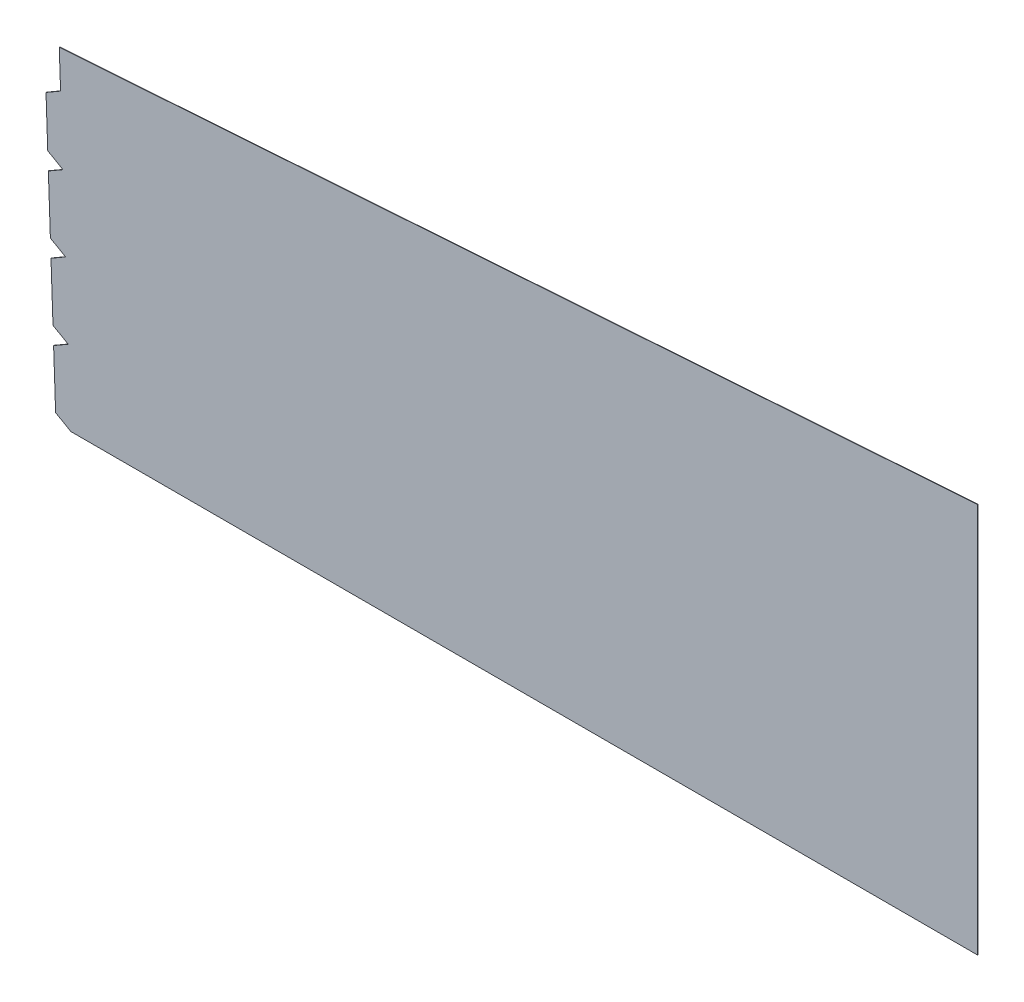
ISO-10303-21;
HEADER;
FILE_DESCRIPTION(('STEP AP214'),'2;1');
FILE_NAME('part.step','',(''),(''),'','','');
FILE_SCHEMA(('AUTOMOTIVE_DESIGN { 1 0 10303 214 1 1 1 1 }'));
ENDSEC;
DATA;
#1=APPLICATION_CONTEXT('core data for automotive mechanical design processes');
#2=APPLICATION_PROTOCOL_DEFINITION('international standard','automotive_design',2000,#1);
#3=PRODUCT_CONTEXT('',#1,'mechanical');
#4=PRODUCT('Part','Part','',(#3));
#5=PRODUCT_RELATED_PRODUCT_CATEGORY('part','',(#4));
#6=PRODUCT_DEFINITION_FORMATION('','',#4);
#7=PRODUCT_DEFINITION_CONTEXT('part definition',#1,'design');
#8=PRODUCT_DEFINITION('design','',#6,#7);
#9=PRODUCT_DEFINITION_SHAPE('','',#8);
#10=(LENGTH_UNIT() NAMED_UNIT(*) SI_UNIT(.MILLI.,.METRE.));
#11=(NAMED_UNIT(*) PLANE_ANGLE_UNIT() SI_UNIT($,.RADIAN.));
#12=(NAMED_UNIT(*) SI_UNIT($,.STERADIAN.) SOLID_ANGLE_UNIT());
#13=UNCERTAINTY_MEASURE_WITH_UNIT(LENGTH_MEASURE(1.E-05),#10,'distance_accuracy_value','');
#14=(GEOMETRIC_REPRESENTATION_CONTEXT(3) GLOBAL_UNCERTAINTY_ASSIGNED_CONTEXT((#13)) GLOBAL_UNIT_ASSIGNED_CONTEXT((#10,
#11,#12)) REPRESENTATION_CONTEXT('',''));
#15=CARTESIAN_POINT('',(0.,0.,0.));
#16=DIRECTION('',(0.,0.,1.));
#17=DIRECTION('',(1.,0.,0.));
#18=AXIS2_PLACEMENT_3D('',#15,#16,#17);
#19=CARTESIAN_POINT('',(0.,0.,0.761999999999999));
#20=DIRECTION('',(0.499999999999994,0.866025403784442,0.));
#21=DIRECTION('',(-0.866025403784442,0.499999999999994,0.));
#22=AXIS2_PLACEMENT_3D('',#19,#20,#21);
#23=PLANE('',#22);
#24=DIRECTION('',(0.866025403784442,-0.499999999999994,0.));
#25=VECTOR('',#24,1.);
#26=CARTESIAN_POINT('',(0.,0.,0.));
#27=LINE('',#26,#25);
#28=CARTESIAN_POINT('',(-25.9446484073002,14.9791497419847,0.));
#29=VERTEX_POINT('',#28);
#30=CARTESIAN_POINT('',(0.,0.,0.));
#31=VERTEX_POINT('',#30);
#32=EDGE_CURVE('E150',#29,#31,#27,.T.);
#33=ORIENTED_EDGE('',*,*,#32,.T.);
#34=DIRECTION('',(0.,0.,-1.));
#35=VECTOR('',#34,1.);
#36=CARTESIAN_POINT('',(0.,0.,0.761999999999999));
#37=LINE('',#36,#35);
#38=CARTESIAN_POINT('',(0.,0.,0.761999999999999));
#39=VERTEX_POINT('',#38);
#40=EDGE_CURVE('E11',#39,#31,#37,.T.);
#41=ORIENTED_EDGE('',*,*,#40,.F.);
#42=DIRECTION('',(0.866025403784442,-0.499999999999994,0.));
#43=VECTOR('',#42,1.);
#44=CARTESIAN_POINT('',(0.,0.,0.761999999999999));
#45=LINE('',#44,#43);
#46=CARTESIAN_POINT('',(-25.9446484073002,14.9791497419847,0.761999999999999));
#47=VERTEX_POINT('',#46);
#48=EDGE_CURVE('E193',#47,#39,#45,.T.);
#49=ORIENTED_EDGE('',*,*,#48,.F.);
#50=DIRECTION('',(0.,0.,-1.));
#51=VECTOR('',#50,1.);
#52=CARTESIAN_POINT('',(-25.9446484073002,14.9791497419847,0.761999999999999));
#53=LINE('',#52,#51);
#54=EDGE_CURVE('E163',#47,#29,#53,.T.);
#55=ORIENTED_EDGE('',*,*,#54,.T.);
#56=EDGE_LOOP('',(#33,#41,#49,#55));
#57=FACE_BOUND('',#56,.T.);
#58=ADVANCED_FACE('F34',(#57),#23,.F.);
#59=CARTESIAN_POINT('',(0.,0.,0.761999999999999));
#60=DIRECTION('',(0.,1.,0.));
#61=DIRECTION('',(0.,0.,1.));
#62=AXIS2_PLACEMENT_3D('',#59,#60,#61);
#63=PLANE('',#62);
#64=DIRECTION('',(1.,0.,0.));
#65=VECTOR('',#64,1.);
#66=CARTESIAN_POINT('',(0.,0.,0.));
#67=LINE('',#66,#65);
#68=CARTESIAN_POINT('',(1549.4,0.,0.));
#69=VERTEX_POINT('',#68);
#70=EDGE_CURVE('E146',#31,#69,#67,.T.);
#71=ORIENTED_EDGE('',*,*,#70,.T.);
#72=DIRECTION('',(0.,0.,-1.));
#73=VECTOR('',#72,1.);
#74=CARTESIAN_POINT('',(1549.4,0.,0.761999999999957));
#75=LINE('',#74,#73);
#76=CARTESIAN_POINT('',(1549.4,0.,0.761999999999957));
#77=VERTEX_POINT('',#76);
#78=EDGE_CURVE('E41',#77,#69,#75,.T.);
#79=ORIENTED_EDGE('',*,*,#78,.F.);
#80=DIRECTION('',(1.,0.,0.));
#81=VECTOR('',#80,1.);
#82=CARTESIAN_POINT('',(0.,0.,0.761999999999999));
#83=LINE('',#82,#81);
#84=EDGE_CURVE('E159',#39,#77,#83,.T.);
#85=ORIENTED_EDGE('',*,*,#84,.F.);
#86=ORIENTED_EDGE('',*,*,#40,.T.);
#87=EDGE_LOOP('',(#71,#79,#85,#86));
#88=FACE_BOUND('',#87,.T.);
#89=ADVANCED_FACE('F158',(#88),#63,.F.);
#90=CARTESIAN_POINT('',(1549.4,0.,0.761999999999957));
#91=DIRECTION('',(-1.,0.,0.));
#92=DIRECTION('',(0.,0.,1.));
#93=AXIS2_PLACEMENT_3D('',#90,#91,#92);
#94=PLANE('',#93);
#95=DIRECTION('',(0.,1.,0.));
#96=VECTOR('',#95,1.);
#97=CARTESIAN_POINT('',(1549.4,0.,0.));
#98=LINE('',#97,#96);
#99=CARTESIAN_POINT('',(1549.4,666.75,0.));
#100=VERTEX_POINT('',#99);
#101=EDGE_CURVE('E152',#69,#100,#98,.T.);
#102=ORIENTED_EDGE('',*,*,#101,.T.);
#103=DIRECTION('',(0.,0.,-1.));
#104=VECTOR('',#103,1.);
#105=CARTESIAN_POINT('',(1549.4,666.75,0.761999999999957));
#106=LINE('',#105,#104);
#107=CARTESIAN_POINT('',(1549.4,666.75,0.761999999999957));
#108=VERTEX_POINT('',#107);
#109=EDGE_CURVE('E259',#108,#100,#106,.T.);
#110=ORIENTED_EDGE('',*,*,#109,.F.);
#111=DIRECTION('',(0.,1.,0.));
#112=VECTOR('',#111,1.);
#113=CARTESIAN_POINT('',(1549.4,0.,0.761999999999957));
#114=LINE('',#113,#112);
#115=EDGE_CURVE('E196',#77,#108,#114,.T.);
#116=ORIENTED_EDGE('',*,*,#115,.F.);
#117=ORIENTED_EDGE('',*,*,#78,.T.);
#118=EDGE_LOOP('',(#102,#110,#116,#117));
#119=FACE_BOUND('',#118,.T.);
#120=ADVANCED_FACE('F263',(#119),#94,.F.);
#121=CARTESIAN_POINT('',(-19.7278929488949,558.8,0.761999999999985));
#122=DIRECTION('',(0.0686339492727787,-0.997641910209882,0.));
#123=DIRECTION('',(0.997641910209881,0.0686339492727789,0.));
#124=AXIS2_PLACEMENT_3D('',#121,#122,#123);
#125=PLANE('',#124);
#126=DIRECTION('',(-0.997641910209881,-0.0686339492727789,0.));
#127=VECTOR('',#126,1.);
#128=CARTESIAN_POINT('',(-19.7278929488949,558.8,0.));
#129=LINE('',#128,#127);
#130=CARTESIAN_POINT('',(-19.7278929488949,558.8,0.));
#131=VERTEX_POINT('',#130);
#132=EDGE_CURVE('E167',#100,#131,#129,.T.);
#133=ORIENTED_EDGE('',*,*,#132,.T.);
#134=DIRECTION('',(0.,0.,-1.));
#135=VECTOR('',#134,1.);
#136=CARTESIAN_POINT('',(-19.7278929488949,558.8,0.761999999999985));
#137=LINE('',#136,#135);
#138=CARTESIAN_POINT('',(-19.7278929488949,558.8,0.761999999999985));
#139=VERTEX_POINT('',#138);
#140=EDGE_CURVE('E256',#139,#131,#137,.T.);
#141=ORIENTED_EDGE('',*,*,#140,.F.);
#142=DIRECTION('',(-0.997641910209881,-0.0686339492727789,0.));
#143=VECTOR('',#142,1.);
#144=CARTESIAN_POINT('',(-19.7278929488949,558.8,0.761999999999985));
#145=LINE('',#144,#143);
#146=EDGE_CURVE('E198',#108,#139,#145,.T.);
#147=ORIENTED_EDGE('',*,*,#146,.F.);
#148=ORIENTED_EDGE('',*,*,#109,.T.);
#149=EDGE_LOOP('',(#133,#141,#147,#148));
#150=FACE_BOUND('',#149,.T.);
#151=ADVANCED_FACE('F271',(#150),#125,.F.);
#152=CARTESIAN_POINT('',(-17.4751999999999,494.991623550298,0.761999999999957));
#153=DIRECTION('',(0.999377394609929,0.0352820512820512,0.));
#154=DIRECTION('',(-0.0352820512820511,0.999377394609929,0.));
#155=AXIS2_PLACEMENT_3D('',#152,#153,#154);
#156=PLANE('',#155);
#157=DIRECTION('',(0.0352820512820511,-0.999377394609929,0.));
#158=VECTOR('',#157,1.);
#159=CARTESIAN_POINT('',(-17.4752,494.991623550298,0.));
#160=LINE('',#159,#158);
#161=CARTESIAN_POINT('',(-17.4752,494.991623550298,0.));
#162=VERTEX_POINT('',#161);
#163=EDGE_CURVE('E169',#131,#162,#160,.T.);
#164=ORIENTED_EDGE('',*,*,#163,.T.);
#165=DIRECTION('',(0.,0.,-1.));
#166=VECTOR('',#165,1.);
#167=CARTESIAN_POINT('',(-17.4751999999999,494.991623550298,0.761999999999957));
#168=LINE('',#167,#166);
#169=CARTESIAN_POINT('',(-17.4751999999999,494.991623550298,0.761999999999957));
#170=VERTEX_POINT('',#169);
#171=EDGE_CURVE('E253',#170,#162,#168,.T.);
#172=ORIENTED_EDGE('',*,*,#171,.F.);
#173=DIRECTION('',(0.0352820512820511,-0.999377394609929,0.));
#174=VECTOR('',#173,1.);
#175=CARTESIAN_POINT('',(-17.4751999999999,494.991623550298,0.761999999999957));
#176=LINE('',#175,#174);
#177=EDGE_CURVE('E200',#139,#170,#176,.T.);
#178=ORIENTED_EDGE('',*,*,#177,.F.);
#179=ORIENTED_EDGE('',*,*,#140,.T.);
#180=EDGE_LOOP('',(#164,#172,#178,#179));
#181=FACE_BOUND('',#180,.T.);
#182=ADVANCED_FACE('F274',(#181),#156,.F.);
#183=CARTESIAN_POINT('',(-42.3833268542371,480.610909805995,0.761999999999957));
#184=DIRECTION('',(0.5,-0.866025403784438,0.));
#185=DIRECTION('',(0.866025403784438,0.500000000000001,0.));
#186=AXIS2_PLACEMENT_3D('',#183,#184,#185);
#187=PLANE('',#186);
#188=DIRECTION('',(-0.866025403784438,-0.500000000000001,0.));
#189=VECTOR('',#188,1.);
#190=CARTESIAN_POINT('',(-42.383326854237,480.610909805995,0.));
#191=LINE('',#190,#189);
#192=CARTESIAN_POINT('',(-42.383326854237,480.610909805995,0.));
#193=VERTEX_POINT('',#192);
#194=EDGE_CURVE('E171',#162,#193,#191,.T.);
#195=ORIENTED_EDGE('',*,*,#194,.T.);
#196=DIRECTION('',(0.,0.,-1.));
#197=VECTOR('',#196,1.);
#198=CARTESIAN_POINT('',(-42.3833268542371,480.610909805995,0.761999999999957));
#199=LINE('',#198,#197);
#200=CARTESIAN_POINT('',(-42.3833268542371,480.610909805995,0.761999999999957));
#201=VERTEX_POINT('',#200);
#202=EDGE_CURVE('E250',#201,#193,#199,.T.);
#203=ORIENTED_EDGE('',*,*,#202,.F.);
#204=DIRECTION('',(-0.866025403784438,-0.500000000000001,0.));
#205=VECTOR('',#204,1.);
#206=CARTESIAN_POINT('',(-42.3833268542371,480.610909805995,0.761999999999957));
#207=LINE('',#206,#205);
#208=EDGE_CURVE('E202',#170,#201,#207,.T.);
#209=ORIENTED_EDGE('',*,*,#208,.F.);
#210=ORIENTED_EDGE('',*,*,#171,.T.);
#211=EDGE_LOOP('',(#195,#203,#209,#210));
#212=FACE_BOUND('',#211,.T.);
#213=ADVANCED_FACE('F279',(#212),#187,.F.);
#214=CARTESIAN_POINT('',(-39.3871099457616,395.741937088368,0.761999999999985));
#215=DIRECTION('',(0.999377394609929,0.0352820512820511,0.));
#216=DIRECTION('',(-0.0352820512820511,0.999377394609929,0.));
#217=AXIS2_PLACEMENT_3D('',#214,#215,#216);
#218=PLANE('',#217);
#219=DIRECTION('',(0.0352820512820511,-0.999377394609929,0.));
#220=VECTOR('',#219,1.);
#221=CARTESIAN_POINT('',(-39.3871099457614,395.741937088368,0.));
#222=LINE('',#221,#220);
#223=CARTESIAN_POINT('',(-39.3871099457614,395.741937088368,0.));
#224=VERTEX_POINT('',#223);
#225=EDGE_CURVE('E173',#193,#224,#222,.T.);
#226=ORIENTED_EDGE('',*,*,#225,.T.);
#227=DIRECTION('',(0.,0.,-1.));
#228=VECTOR('',#227,1.);
#229=CARTESIAN_POINT('',(-39.3871099457616,395.741937088368,0.761999999999985));
#230=LINE('',#229,#228);
#231=CARTESIAN_POINT('',(-39.3871099457616,395.741937088368,0.761999999999985));
#232=VERTEX_POINT('',#231);
#233=EDGE_CURVE('E247',#232,#224,#230,.T.);
#234=ORIENTED_EDGE('',*,*,#233,.F.);
#235=DIRECTION('',(0.0352820512820511,-0.999377394609929,0.));
#236=VECTOR('',#235,1.);
#237=CARTESIAN_POINT('',(-39.3871099457616,395.741937088368,0.761999999999985));
#238=LINE('',#237,#236);
#239=EDGE_CURVE('E204',#201,#232,#238,.T.);
#240=ORIENTED_EDGE('',*,*,#239,.F.);
#241=ORIENTED_EDGE('',*,*,#202,.T.);
#242=EDGE_LOOP('',(#226,#234,#240,#241));
#243=FACE_BOUND('',#242,.T.);
#244=ADVANCED_FACE('F285',(#243),#218,.F.);
#245=CARTESIAN_POINT('',(-13.4424615384614,380.762787346383,0.761999999999985));
#246=DIRECTION('',(0.499999999999994,0.866025403784442,0.));
#247=DIRECTION('',(-0.866025403784442,0.499999999999994,0.));
#248=AXIS2_PLACEMENT_3D('',#245,#246,#247);
#249=PLANE('',#248);
#250=DIRECTION('',(0.866025403784442,-0.499999999999994,0.));
#251=VECTOR('',#250,1.);
#252=CARTESIAN_POINT('',(-13.4424615384615,380.762787346383,0.));
#253=LINE('',#252,#251);
#254=CARTESIAN_POINT('',(-13.4424615384615,380.762787346383,0.));
#255=VERTEX_POINT('',#254);
#256=EDGE_CURVE('E175',#224,#255,#253,.T.);
#257=ORIENTED_EDGE('',*,*,#256,.T.);
#258=DIRECTION('',(0.,0.,-1.));
#259=VECTOR('',#258,1.);
#260=CARTESIAN_POINT('',(-13.4424615384614,380.762787346383,0.761999999999985));
#261=LINE('',#260,#259);
#262=CARTESIAN_POINT('',(-13.4424615384614,380.762787346383,0.761999999999985));
#263=VERTEX_POINT('',#262);
#264=EDGE_CURVE('E244',#263,#255,#261,.T.);
#265=ORIENTED_EDGE('',*,*,#264,.F.);
#266=DIRECTION('',(0.866025403784442,-0.499999999999994,0.));
#267=VECTOR('',#266,1.);
#268=CARTESIAN_POINT('',(-13.4424615384614,380.762787346383,0.761999999999985));
#269=LINE('',#268,#267);
#270=EDGE_CURVE('E206',#232,#263,#269,.T.);
#271=ORIENTED_EDGE('',*,*,#270,.F.);
#272=ORIENTED_EDGE('',*,*,#233,.T.);
#273=EDGE_LOOP('',(#257,#265,#271,#272));
#274=FACE_BOUND('',#273,.T.);
#275=ADVANCED_FACE('F289',(#274),#249,.F.);
#276=CARTESIAN_POINT('',(-38.3505883926986,366.38207360208,0.761999999999957));
#277=DIRECTION('',(0.5,-0.866025403784438,0.));
#278=DIRECTION('',(0.866025403784438,0.500000000000001,0.));
#279=AXIS2_PLACEMENT_3D('',#276,#277,#278);
#280=PLANE('',#279);
#281=DIRECTION('',(-0.866025403784438,-0.500000000000001,0.));
#282=VECTOR('',#281,1.);
#283=CARTESIAN_POINT('',(-38.3505883926984,366.38207360208,0.));
#284=LINE('',#283,#282);
#285=CARTESIAN_POINT('',(-38.3505883926984,366.38207360208,0.));
#286=VERTEX_POINT('',#285);
#287=EDGE_CURVE('E177',#255,#286,#284,.T.);
#288=ORIENTED_EDGE('',*,*,#287,.T.);
#289=DIRECTION('',(0.,0.,-1.));
#290=VECTOR('',#289,1.);
#291=CARTESIAN_POINT('',(-38.3505883926986,366.38207360208,0.761999999999957));
#292=LINE('',#291,#290);
#293=CARTESIAN_POINT('',(-38.3505883926986,366.38207360208,0.761999999999957));
#294=VERTEX_POINT('',#293);
#295=EDGE_CURVE('E241',#294,#286,#292,.T.);
#296=ORIENTED_EDGE('',*,*,#295,.F.);
#297=DIRECTION('',(-0.866025403784438,-0.500000000000001,0.));
#298=VECTOR('',#297,1.);
#299=CARTESIAN_POINT('',(-38.3505883926986,366.38207360208,0.761999999999957));
#300=LINE('',#299,#298);
#301=EDGE_CURVE('E208',#263,#294,#300,.T.);
#302=ORIENTED_EDGE('',*,*,#301,.F.);
#303=ORIENTED_EDGE('',*,*,#264,.T.);
#304=EDGE_LOOP('',(#288,#296,#302,#303));
#305=FACE_BOUND('',#304,.T.);
#306=ADVANCED_FACE('F294',(#305),#280,.F.);
#307=CARTESIAN_POINT('',(-34.9062894329412,268.821007972907,0.762000000000013));
#308=DIRECTION('',(0.999377394609929,0.0352820512820512,0.));
#309=DIRECTION('',(-0.035282051282051,0.999377394609929,0.));
#310=AXIS2_PLACEMENT_3D('',#307,#308,#309);
#311=PLANE('',#310);
#312=DIRECTION('',(0.0352820512820511,-0.999377394609929,0.));
#313=VECTOR('',#312,1.);
#314=CARTESIAN_POINT('',(-34.9062894329411,268.821007972907,0.));
#315=LINE('',#314,#313);
#316=CARTESIAN_POINT('',(-34.9062894329411,268.821007972907,0.));
#317=VERTEX_POINT('',#316);
#318=EDGE_CURVE('E179',#286,#317,#315,.T.);
#319=ORIENTED_EDGE('',*,*,#318,.T.);
#320=DIRECTION('',(0.,0.,-1.));
#321=VECTOR('',#320,1.);
#322=CARTESIAN_POINT('',(-34.9062894329412,268.821007972907,0.762000000000013));
#323=LINE('',#322,#321);
#324=CARTESIAN_POINT('',(-34.9062894329412,268.821007972907,0.762000000000013));
#325=VERTEX_POINT('',#324);
#326=EDGE_CURVE('E238',#325,#317,#323,.T.);
#327=ORIENTED_EDGE('',*,*,#326,.F.);
#328=DIRECTION('',(0.0352820512820511,-0.999377394609929,0.));
#329=VECTOR('',#328,1.);
#330=CARTESIAN_POINT('',(-34.9062894329412,268.821007972907,0.762000000000013));
#331=LINE('',#330,#329);
#332=EDGE_CURVE('E210',#294,#325,#331,.T.);
#333=ORIENTED_EDGE('',*,*,#332,.F.);
#334=ORIENTED_EDGE('',*,*,#295,.T.);
#335=EDGE_LOOP('',(#319,#327,#333,#334));
#336=FACE_BOUND('',#335,.T.);
#337=ADVANCED_FACE('F300',(#336),#311,.F.);
#338=CARTESIAN_POINT('',(-8.9616410256409,253.841858230922,0.761999999999985));
#339=DIRECTION('',(0.499999999999994,0.866025403784442,0.));
#340=DIRECTION('',(-0.866025403784442,0.499999999999994,0.));
#341=AXIS2_PLACEMENT_3D('',#338,#339,#340);
#342=PLANE('',#341);
#343=DIRECTION('',(0.866025403784442,-0.499999999999994,0.));
#344=VECTOR('',#343,1.);
#345=CARTESIAN_POINT('',(-8.96164102564101,253.841858230922,0.));
#346=LINE('',#345,#344);
#347=CARTESIAN_POINT('',(-8.96164102564101,253.841858230922,0.));
#348=VERTEX_POINT('',#347);
#349=EDGE_CURVE('E181',#317,#348,#346,.T.);
#350=ORIENTED_EDGE('',*,*,#349,.T.);
#351=DIRECTION('',(0.,0.,-1.));
#352=VECTOR('',#351,1.);
#353=CARTESIAN_POINT('',(-8.9616410256409,253.841858230922,0.761999999999985));
#354=LINE('',#353,#352);
#355=CARTESIAN_POINT('',(-8.9616410256409,253.841858230922,0.761999999999985));
#356=VERTEX_POINT('',#355);
#357=EDGE_CURVE('E235',#356,#348,#354,.T.);
#358=ORIENTED_EDGE('',*,*,#357,.F.);
#359=DIRECTION('',(0.866025403784442,-0.499999999999994,0.));
#360=VECTOR('',#359,1.);
#361=CARTESIAN_POINT('',(-8.9616410256409,253.841858230922,0.761999999999985));
#362=LINE('',#361,#360);
#363=EDGE_CURVE('E212',#325,#356,#362,.T.);
#364=ORIENTED_EDGE('',*,*,#363,.F.);
#365=ORIENTED_EDGE('',*,*,#326,.T.);
#366=EDGE_LOOP('',(#350,#358,#364,#365));
#367=FACE_BOUND('',#366,.T.);
#368=ADVANCED_FACE('F304',(#367),#342,.F.);
#369=CARTESIAN_POINT('',(-33.8697678798781,239.461144486619,0.761999999999985));
#370=DIRECTION('',(0.5,-0.866025403784439,0.));
#371=DIRECTION('',(0.866025403784439,0.5,0.));
#372=AXIS2_PLACEMENT_3D('',#369,#370,#371);
#373=PLANE('',#372);
#374=DIRECTION('',(-0.866025403784439,-0.5,0.));
#375=VECTOR('',#374,1.);
#376=CARTESIAN_POINT('',(-33.8697678798779,239.461144486619,0.));
#377=LINE('',#376,#375);
#378=CARTESIAN_POINT('',(-33.8697678798779,239.461144486619,0.));
#379=VERTEX_POINT('',#378);
#380=EDGE_CURVE('E183',#348,#379,#377,.T.);
#381=ORIENTED_EDGE('',*,*,#380,.T.);
#382=DIRECTION('',(0.,0.,-1.));
#383=VECTOR('',#382,1.);
#384=CARTESIAN_POINT('',(-33.8697678798781,239.461144486619,0.761999999999985));
#385=LINE('',#384,#383);
#386=CARTESIAN_POINT('',(-33.8697678798781,239.461144486619,0.761999999999985));
#387=VERTEX_POINT('',#386);
#388=EDGE_CURVE('E232',#387,#379,#385,.T.);
#389=ORIENTED_EDGE('',*,*,#388,.F.);
#390=DIRECTION('',(-0.866025403784439,-0.5,0.));
#391=VECTOR('',#390,1.);
#392=CARTESIAN_POINT('',(-33.8697678798781,239.461144486619,0.761999999999985));
#393=LINE('',#392,#391);
#394=EDGE_CURVE('E214',#356,#387,#393,.T.);
#395=ORIENTED_EDGE('',*,*,#394,.F.);
#396=ORIENTED_EDGE('',*,*,#357,.T.);
#397=EDGE_LOOP('',(#381,#389,#395,#396));
#398=FACE_BOUND('',#397,.T.);
#399=ADVANCED_FACE('F309',(#398),#373,.F.);
#400=CARTESIAN_POINT('',(-30.4254689201205,141.900078857446,0.761999999999999));
#401=DIRECTION('',(0.999377394609929,0.0352820512820512,0.));
#402=DIRECTION('',(-0.035282051282051,0.999377394609929,0.));
#403=AXIS2_PLACEMENT_3D('',#400,#401,#402);
#404=PLANE('',#403);
#405=DIRECTION('',(0.035282051282051,-0.999377394609929,0.));
#406=VECTOR('',#405,1.);
#407=CARTESIAN_POINT('',(-30.4254689201207,141.900078857446,0.));
#408=LINE('',#407,#406);
#409=CARTESIAN_POINT('',(-30.4254689201207,141.900078857446,0.));
#410=VERTEX_POINT('',#409);
#411=EDGE_CURVE('E185',#379,#410,#408,.T.);
#412=ORIENTED_EDGE('',*,*,#411,.T.);
#413=DIRECTION('',(0.,0.,-1.));
#414=VECTOR('',#413,1.);
#415=CARTESIAN_POINT('',(-30.4254689201205,141.900078857446,0.761999999999999));
#416=LINE('',#415,#414);
#417=CARTESIAN_POINT('',(-30.4254689201205,141.900078857446,0.761999999999999));
#418=VERTEX_POINT('',#417);
#419=EDGE_CURVE('E229',#418,#410,#416,.T.);
#420=ORIENTED_EDGE('',*,*,#419,.F.);
#421=DIRECTION('',(0.035282051282051,-0.999377394609929,0.));
#422=VECTOR('',#421,1.);
#423=CARTESIAN_POINT('',(-30.4254689201205,141.900078857446,0.761999999999999));
#424=LINE('',#423,#422);
#425=EDGE_CURVE('E216',#387,#418,#424,.T.);
#426=ORIENTED_EDGE('',*,*,#425,.F.);
#427=ORIENTED_EDGE('',*,*,#388,.T.);
#428=EDGE_LOOP('',(#412,#420,#426,#427));
#429=FACE_BOUND('',#428,.T.);
#430=ADVANCED_FACE('F315',(#429),#404,.F.);
#431=CARTESIAN_POINT('',(-4.4808205128205,126.920929115461,0.761999999999985));
#432=DIRECTION('',(0.499999999999994,0.866025403784442,0.));
#433=DIRECTION('',(-0.866025403784442,0.499999999999994,0.));
#434=AXIS2_PLACEMENT_3D('',#431,#432,#433);
#435=PLANE('',#434);
#436=DIRECTION('',(0.866025403784442,-0.499999999999994,0.));
#437=VECTOR('',#436,1.);
#438=CARTESIAN_POINT('',(-4.4808205128205,126.920929115461,0.));
#439=LINE('',#438,#437);
#440=CARTESIAN_POINT('',(-4.4808205128205,126.920929115461,0.));
#441=VERTEX_POINT('',#440);
#442=EDGE_CURVE('E187',#410,#441,#439,.T.);
#443=ORIENTED_EDGE('',*,*,#442,.T.);
#444=DIRECTION('',(0.,0.,-1.));
#445=VECTOR('',#444,1.);
#446=CARTESIAN_POINT('',(-4.4808205128205,126.920929115461,0.761999999999985));
#447=LINE('',#446,#445);
#448=CARTESIAN_POINT('',(-4.4808205128205,126.920929115461,0.761999999999985));
#449=VERTEX_POINT('',#448);
#450=EDGE_CURVE('E226',#449,#441,#447,.T.);
#451=ORIENTED_EDGE('',*,*,#450,.F.);
#452=DIRECTION('',(0.866025403784442,-0.499999999999994,0.));
#453=VECTOR('',#452,1.);
#454=CARTESIAN_POINT('',(-4.4808205128205,126.920929115461,0.761999999999985));
#455=LINE('',#454,#453);
#456=EDGE_CURVE('E218',#418,#449,#455,.T.);
#457=ORIENTED_EDGE('',*,*,#456,.F.);
#458=ORIENTED_EDGE('',*,*,#419,.T.);
#459=EDGE_LOOP('',(#443,#451,#457,#458));
#460=FACE_BOUND('',#459,.T.);
#461=ADVANCED_FACE('F319',(#460),#435,.F.);
#462=CARTESIAN_POINT('',(-29.3889473670574,112.540215371158,0.762000000000013));
#463=DIRECTION('',(0.5,-0.866025403784439,0.));
#464=DIRECTION('',(0.866025403784439,0.5,0.));
#465=AXIS2_PLACEMENT_3D('',#462,#463,#464);
#466=PLANE('',#465);
#467=DIRECTION('',(-0.866025403784439,-0.5,0.));
#468=VECTOR('',#467,1.);
#469=CARTESIAN_POINT('',(-29.3889473670574,112.540215371158,0.));
#470=LINE('',#469,#468);
#471=CARTESIAN_POINT('',(-29.3889473670574,112.540215371158,0.));
#472=VERTEX_POINT('',#471);
#473=EDGE_CURVE('E189',#441,#472,#470,.T.);
#474=ORIENTED_EDGE('',*,*,#473,.T.);
#475=DIRECTION('',(0.,0.,-1.));
#476=VECTOR('',#475,1.);
#477=CARTESIAN_POINT('',(-29.3889473670574,112.540215371158,0.762000000000013));
#478=LINE('',#477,#476);
#479=CARTESIAN_POINT('',(-29.3889473670574,112.540215371158,0.762000000000013));
#480=VERTEX_POINT('',#479);
#481=EDGE_CURVE('E223',#480,#472,#478,.T.);
#482=ORIENTED_EDGE('',*,*,#481,.F.);
#483=DIRECTION('',(-0.866025403784439,-0.5,0.));
#484=VECTOR('',#483,1.);
#485=CARTESIAN_POINT('',(-29.3889473670574,112.540215371158,0.762000000000013));
#486=LINE('',#485,#484);
#487=EDGE_CURVE('E53',#449,#480,#486,.T.);
#488=ORIENTED_EDGE('',*,*,#487,.F.);
#489=ORIENTED_EDGE('',*,*,#450,.T.);
#490=EDGE_LOOP('',(#474,#482,#488,#489));
#491=FACE_BOUND('',#490,.T.);
#492=ADVANCED_FACE('F322',(#491),#466,.F.);
#493=CARTESIAN_POINT('',(-25.9446484073002,14.9791497419847,0.761999999999999));
#494=DIRECTION('',(0.999377394609929,0.0352820512820512,0.));
#495=DIRECTION('',(-0.0352820512820511,0.999377394609929,0.));
#496=AXIS2_PLACEMENT_3D('',#493,#494,#495);
#497=PLANE('',#496);
#498=DIRECTION('',(0.0352820512820511,-0.999377394609929,0.));
#499=VECTOR('',#498,1.);
#500=CARTESIAN_POINT('',(-25.9446484073002,14.9791497419847,0.));
#501=LINE('',#500,#499);
#502=EDGE_CURVE('E191',#472,#29,#501,.T.);
#503=ORIENTED_EDGE('',*,*,#502,.T.);
#504=ORIENTED_EDGE('',*,*,#54,.F.);
#505=DIRECTION('',(0.0352820512820511,-0.999377394609929,0.));
#506=VECTOR('',#505,1.);
#507=CARTESIAN_POINT('',(-25.9446484073002,14.9791497419847,0.761999999999999));
#508=LINE('',#507,#506);
#509=EDGE_CURVE('E48',#480,#47,#508,.T.);
#510=ORIENTED_EDGE('',*,*,#509,.F.);
#511=ORIENTED_EDGE('',*,*,#481,.T.);
#512=EDGE_LOOP('',(#503,#504,#510,#511));
#513=FACE_BOUND('',#512,.T.);
#514=ADVANCED_FACE('F324',(#513),#497,.F.);
#515=CARTESIAN_POINT('',(1549.4,-894.546507082393,0.762000000000068));
#516=DIRECTION('',(0.,0.,-1.));
#517=DIRECTION('',(-1.,0.,0.));
#518=AXIS2_PLACEMENT_3D('',#515,#516,#517);
#519=PLANE('',#518);
#520=ORIENTED_EDGE('',*,*,#48,.T.);
#521=ORIENTED_EDGE('',*,*,#84,.T.);
#522=ORIENTED_EDGE('',*,*,#115,.T.);
#523=ORIENTED_EDGE('',*,*,#146,.T.);
#524=ORIENTED_EDGE('',*,*,#177,.T.);
#525=ORIENTED_EDGE('',*,*,#208,.T.);
#526=ORIENTED_EDGE('',*,*,#239,.T.);
#527=ORIENTED_EDGE('',*,*,#270,.T.);
#528=ORIENTED_EDGE('',*,*,#301,.T.);
#529=ORIENTED_EDGE('',*,*,#332,.T.);
#530=ORIENTED_EDGE('',*,*,#363,.T.);
#531=ORIENTED_EDGE('',*,*,#394,.T.);
#532=ORIENTED_EDGE('',*,*,#425,.T.);
#533=ORIENTED_EDGE('',*,*,#456,.T.);
#534=ORIENTED_EDGE('',*,*,#487,.T.);
#535=ORIENTED_EDGE('',*,*,#509,.T.);
#536=EDGE_LOOP('',(#520,#521,#522,#523,#524,#525,#526,#527,#528,#529,#530,#531,#532,#533,#534,#535));
#537=FACE_BOUND('',#536,.T.);
#538=ADVANCED_FACE('F266',(#537),#519,.F.);
#539=CARTESIAN_POINT('',(1549.4,-894.546507082393,0.));
#540=DIRECTION('',(0.,0.,-1.));
#541=DIRECTION('',(-1.,0.,0.));
#542=AXIS2_PLACEMENT_3D('',#539,#540,#541);
#543=PLANE('',#542);
#544=ORIENTED_EDGE('',*,*,#32,.F.);
#545=ORIENTED_EDGE('',*,*,#502,.F.);
#546=ORIENTED_EDGE('',*,*,#473,.F.);
#547=ORIENTED_EDGE('',*,*,#442,.F.);
#548=ORIENTED_EDGE('',*,*,#411,.F.);
#549=ORIENTED_EDGE('',*,*,#380,.F.);
#550=ORIENTED_EDGE('',*,*,#349,.F.);
#551=ORIENTED_EDGE('',*,*,#318,.F.);
#552=ORIENTED_EDGE('',*,*,#287,.F.);
#553=ORIENTED_EDGE('',*,*,#256,.F.);
#554=ORIENTED_EDGE('',*,*,#225,.F.);
#555=ORIENTED_EDGE('',*,*,#194,.F.);
#556=ORIENTED_EDGE('',*,*,#163,.F.);
#557=ORIENTED_EDGE('',*,*,#132,.F.);
#558=ORIENTED_EDGE('',*,*,#101,.F.);
#559=ORIENTED_EDGE('',*,*,#70,.F.);
#560=EDGE_LOOP('',(#544,#545,#546,#547,#548,#549,#550,#551,#552,#553,#554,#555,#556,#557,#558,#559));
#561=FACE_BOUND('',#560,.T.);
#562=ADVANCED_FACE('F147',(#561),#543,.T.);
#563=CLOSED_SHELL('',(#58,#89,#120,#151,#182,#213,#244,#275,#306,#337,#368,#399,#430,#461,#492,
#514,#538,#562));
#564=MANIFOLD_SOLID_BREP('B2',#563);
#565=ADVANCED_BREP_SHAPE_REPRESENTATION('',(#18,#564),#14);
#566=SHAPE_DEFINITION_REPRESENTATION(#9,#565);
ENDSEC;
END-ISO-10303-21;
